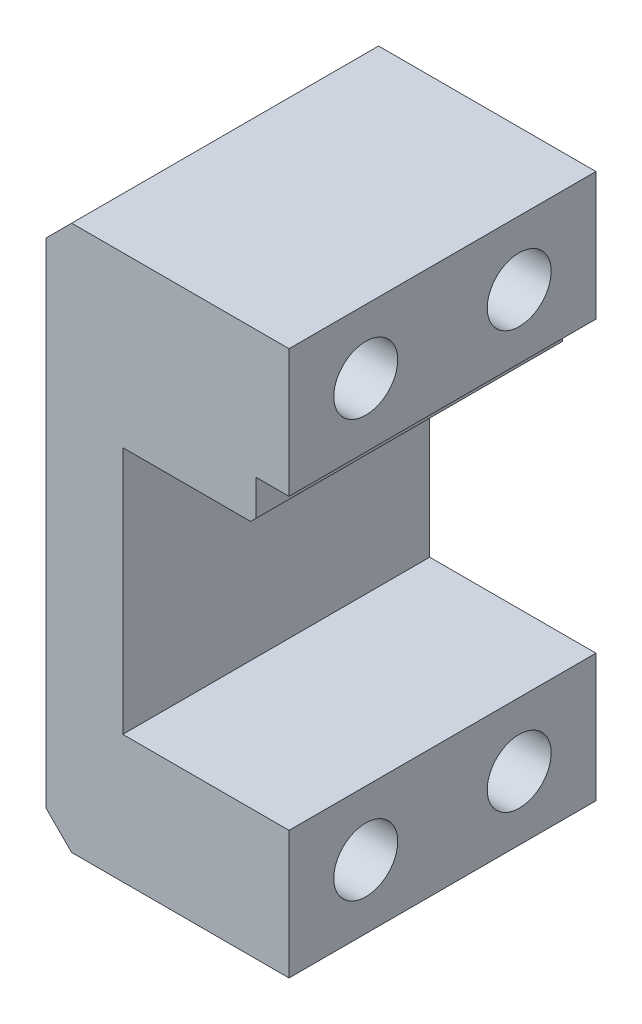
ISO-10303-21;
HEADER;
FILE_DESCRIPTION(('STEP AP214'),'2;1');
FILE_NAME('part.step','',(''),(''),'','','');
FILE_SCHEMA(('AUTOMOTIVE_DESIGN { 1 0 10303 214 1 1 1 1 }'));
ENDSEC;
DATA;
#1=APPLICATION_CONTEXT('core data for automotive mechanical design processes');
#2=APPLICATION_PROTOCOL_DEFINITION('international standard','automotive_design',2000,#1);
#3=PRODUCT_CONTEXT('',#1,'mechanical');
#4=PRODUCT('Part','Part','',(#3));
#5=PRODUCT_RELATED_PRODUCT_CATEGORY('part','',(#4));
#6=PRODUCT_DEFINITION_FORMATION('','',#4);
#7=PRODUCT_DEFINITION_CONTEXT('part definition',#1,'design');
#8=PRODUCT_DEFINITION('design','',#6,#7);
#9=PRODUCT_DEFINITION_SHAPE('','',#8);
#10=(LENGTH_UNIT() NAMED_UNIT(*) SI_UNIT(.MILLI.,.METRE.));
#11=(NAMED_UNIT(*) PLANE_ANGLE_UNIT() SI_UNIT($,.RADIAN.));
#12=(NAMED_UNIT(*) SI_UNIT($,.STERADIAN.) SOLID_ANGLE_UNIT());
#13=UNCERTAINTY_MEASURE_WITH_UNIT(LENGTH_MEASURE(1.E-05),#10,'distance_accuracy_value','');
#14=(GEOMETRIC_REPRESENTATION_CONTEXT(3) GLOBAL_UNCERTAINTY_ASSIGNED_CONTEXT((#13)) GLOBAL_UNIT_ASSIGNED_CONTEXT((#10,
#11,#12)) REPRESENTATION_CONTEXT('',''));
#15=CARTESIAN_POINT('',(0.,0.,0.));
#16=DIRECTION('',(0.,0.,1.));
#17=DIRECTION('',(1.,0.,0.));
#18=AXIS2_PLACEMENT_3D('',#15,#16,#17);
#19=CARTESIAN_POINT('',(9.5,0.,12.));
#20=DIRECTION('',(0.,1.,0.));
#21=DIRECTION('',(-1.,0.,0.));
#22=AXIS2_PLACEMENT_3D('',#19,#20,#21);
#23=PLANE('',#22);
#24=DIRECTION('',(1.,0.,0.));
#25=VECTOR('',#24,1.);
#26=CARTESIAN_POINT('',(9.5,0.,12.));
#27=LINE('',#26,#25);
#28=CARTESIAN_POINT('',(1.,0.,12.));
#29=VERTEX_POINT('',#28);
#30=CARTESIAN_POINT('',(9.5,0.,12.));
#31=VERTEX_POINT('',#30);
#32=EDGE_CURVE('E132',#29,#31,#27,.T.);
#33=ORIENTED_EDGE('',*,*,#32,.F.);
#34=DIRECTION('',(0.,0.,-1.));
#35=VECTOR('',#34,1.);
#36=CARTESIAN_POINT('',(1.,0.,12.));
#37=LINE('',#36,#35);
#38=CARTESIAN_POINT('',(1.,0.,0.));
#39=VERTEX_POINT('',#38);
#40=EDGE_CURVE('E170',#29,#39,#37,.T.);
#41=ORIENTED_EDGE('',*,*,#40,.T.);
#42=DIRECTION('',(1.,0.,0.));
#43=VECTOR('',#42,1.);
#44=CARTESIAN_POINT('',(9.5,0.,0.));
#45=LINE('',#44,#43);
#46=CARTESIAN_POINT('',(9.5,0.,0.));
#47=VERTEX_POINT('',#46);
#48=EDGE_CURVE('E154',#39,#47,#45,.T.);
#49=ORIENTED_EDGE('',*,*,#48,.T.);
#50=DIRECTION('',(0.,0.,-1.));
#51=VECTOR('',#50,1.);
#52=CARTESIAN_POINT('',(9.5,0.,12.));
#53=LINE('',#52,#51);
#54=EDGE_CURVE('E147',#31,#47,#53,.T.);
#55=ORIENTED_EDGE('',*,*,#54,.F.);
#56=EDGE_LOOP('',(#33,#41,#49,#55));
#57=FACE_BOUND('',#56,.T.);
#58=ADVANCED_FACE('F36',(#57),#23,.F.);
#59=CARTESIAN_POINT('',(9.5,5.,12.));
#60=DIRECTION('',(-1.,0.,0.));
#61=DIRECTION('',(0.,-1.,0.));
#62=AXIS2_PLACEMENT_3D('',#59,#60,#61);
#63=PLANE('',#62);
#64=CARTESIAN_POINT('',(9.5,2.5,3.));
#65=DIRECTION('',(-1.,0.,0.));
#66=DIRECTION('',(0.,0.,1.));
#67=AXIS2_PLACEMENT_3D('',#64,#65,#66);
#68=CIRCLE('',#67,1.25);
#69=CARTESIAN_POINT('',(9.5,2.5,4.25));
#70=VERTEX_POINT('',#69);
#71=EDGE_CURVE('E329',#70,#70,#68,.T.);
#72=ORIENTED_EDGE('',*,*,#71,.T.);
#73=EDGE_LOOP('',(#72));
#74=FACE_BOUND('',#73,.T.);
#75=CARTESIAN_POINT('',(9.5,2.5,9.));
#76=DIRECTION('',(-1.,0.,0.));
#77=DIRECTION('',(0.,0.,1.));
#78=AXIS2_PLACEMENT_3D('',#75,#76,#77);
#79=CIRCLE('',#78,1.25);
#80=CARTESIAN_POINT('',(9.5,2.5,10.25));
#81=VERTEX_POINT('',#80);
#82=EDGE_CURVE('E339',#81,#81,#79,.T.);
#83=ORIENTED_EDGE('',*,*,#82,.T.);
#84=EDGE_LOOP('',(#83));
#85=FACE_BOUND('',#84,.T.);
#86=DIRECTION('',(0.,1.,0.));
#87=VECTOR('',#86,1.);
#88=CARTESIAN_POINT('',(9.5,5.,0.));
#89=LINE('',#88,#87);
#90=CARTESIAN_POINT('',(9.5,5.,0.));
#91=VERTEX_POINT('',#90);
#92=EDGE_CURVE('E232',#47,#91,#89,.T.);
#93=ORIENTED_EDGE('',*,*,#92,.T.);
#94=DIRECTION('',(0.,0.,-1.));
#95=VECTOR('',#94,1.);
#96=CARTESIAN_POINT('',(9.5,5.,12.));
#97=LINE('',#96,#95);
#98=CARTESIAN_POINT('',(9.5,5.,12.));
#99=VERTEX_POINT('',#98);
#100=EDGE_CURVE('E149',#99,#91,#97,.T.);
#101=ORIENTED_EDGE('',*,*,#100,.F.);
#102=DIRECTION('',(0.,1.,0.));
#103=VECTOR('',#102,1.);
#104=CARTESIAN_POINT('',(9.5,5.,12.));
#105=LINE('',#104,#103);
#106=EDGE_CURVE('E135',#31,#99,#105,.T.);
#107=ORIENTED_EDGE('',*,*,#106,.F.);
#108=ORIENTED_EDGE('',*,*,#54,.T.);
#109=EDGE_LOOP('',(#93,#101,#107,#108));
#110=FACE_BOUND('',#109,.T.);
#111=ADVANCED_FACE('F146',(#74,#85,#110),#63,.F.);
#112=CARTESIAN_POINT('',(3.,5.,12.));
#113=DIRECTION('',(0.,-1.,0.));
#114=DIRECTION('',(1.,0.,0.));
#115=AXIS2_PLACEMENT_3D('',#112,#113,#114);
#116=PLANE('',#115);
#117=DIRECTION('',(-1.,0.,0.));
#118=VECTOR('',#117,1.);
#119=CARTESIAN_POINT('',(3.,5.,0.));
#120=LINE('',#119,#118);
#121=CARTESIAN_POINT('',(3.,5.,0.));
#122=VERTEX_POINT('',#121);
#123=EDGE_CURVE('E226',#91,#122,#120,.T.);
#124=ORIENTED_EDGE('',*,*,#123,.T.);
#125=DIRECTION('',(0.,0.,-1.));
#126=VECTOR('',#125,1.);
#127=CARTESIAN_POINT('',(3.,5.,12.));
#128=LINE('',#127,#126);
#129=CARTESIAN_POINT('',(3.,5.,12.));
#130=VERTEX_POINT('',#129);
#131=EDGE_CURVE('E161',#130,#122,#128,.T.);
#132=ORIENTED_EDGE('',*,*,#131,.F.);
#133=DIRECTION('',(-1.,0.,0.));
#134=VECTOR('',#133,1.);
#135=CARTESIAN_POINT('',(3.,5.,12.));
#136=LINE('',#135,#134);
#137=EDGE_CURVE('E151',#99,#130,#136,.T.);
#138=ORIENTED_EDGE('',*,*,#137,.F.);
#139=ORIENTED_EDGE('',*,*,#100,.T.);
#140=EDGE_LOOP('',(#124,#132,#138,#139));
#141=FACE_BOUND('',#140,.T.);
#142=ADVANCED_FACE('F255',(#141),#116,.F.);
#143=CARTESIAN_POINT('',(3.,14.71,12.));
#144=DIRECTION('',(-1.,0.,0.));
#145=DIRECTION('',(0.,-1.,0.));
#146=AXIS2_PLACEMENT_3D('',#143,#144,#145);
#147=PLANE('',#146);
#148=DIRECTION('',(0.,1.,0.));
#149=VECTOR('',#148,1.);
#150=CARTESIAN_POINT('',(3.,14.71,0.));
#151=LINE('',#150,#149);
#152=CARTESIAN_POINT('',(3.,14.71,0.));
#153=VERTEX_POINT('',#152);
#154=EDGE_CURVE('E221',#122,#153,#151,.T.);
#155=ORIENTED_EDGE('',*,*,#154,.T.);
#156=DIRECTION('',(0.,0.,-1.));
#157=VECTOR('',#156,1.);
#158=CARTESIAN_POINT('',(3.,14.71,12.));
#159=LINE('',#158,#157);
#160=CARTESIAN_POINT('',(3.,14.71,12.));
#161=VERTEX_POINT('',#160);
#162=EDGE_CURVE('E212',#161,#153,#159,.T.);
#163=ORIENTED_EDGE('',*,*,#162,.F.);
#164=DIRECTION('',(0.,1.,0.));
#165=VECTOR('',#164,1.);
#166=CARTESIAN_POINT('',(3.,14.71,12.));
#167=LINE('',#166,#165);
#168=EDGE_CURVE('E222',#130,#161,#167,.T.);
#169=ORIENTED_EDGE('',*,*,#168,.F.);
#170=ORIENTED_EDGE('',*,*,#131,.T.);
#171=EDGE_LOOP('',(#155,#163,#169,#170));
#172=FACE_BOUND('',#171,.T.);
#173=ADVANCED_FACE('F219',(#172),#147,.F.);
#174=CARTESIAN_POINT('',(8.2,14.71,12.));
#175=DIRECTION('',(0.,1.,0.));
#176=DIRECTION('',(-1.,0.,0.));
#177=AXIS2_PLACEMENT_3D('',#174,#175,#176);
#178=PLANE('',#177);
#179=DIRECTION('',(1.,0.,0.));
#180=VECTOR('',#179,1.);
#181=CARTESIAN_POINT('',(8.2,14.71,0.));
#182=LINE('',#181,#180);
#183=CARTESIAN_POINT('',(8.,14.71,0.));
#184=VERTEX_POINT('',#183);
#185=EDGE_CURVE('E228',#153,#184,#182,.T.);
#186=ORIENTED_EDGE('',*,*,#185,.T.);
#187=DIRECTION('',(0.,0.,1.));
#188=VECTOR('',#187,1.);
#189=CARTESIAN_POINT('',(8.,14.71,12.));
#190=LINE('',#189,#188);
#191=CARTESIAN_POINT('',(8.,14.71,12.));
#192=VERTEX_POINT('',#191);
#193=EDGE_CURVE('E166',#184,#192,#190,.T.);
#194=ORIENTED_EDGE('',*,*,#193,.T.);
#195=DIRECTION('',(1.,0.,0.));
#196=VECTOR('',#195,1.);
#197=CARTESIAN_POINT('',(8.2,14.71,12.));
#198=LINE('',#197,#196);
#199=EDGE_CURVE('E257',#161,#192,#198,.T.);
#200=ORIENTED_EDGE('',*,*,#199,.F.);
#201=ORIENTED_EDGE('',*,*,#162,.T.);
#202=EDGE_LOOP('',(#186,#194,#200,#201));
#203=FACE_BOUND('',#202,.T.);
#204=ADVANCED_FACE('F269',(#203),#178,.F.);
#205=CARTESIAN_POINT('',(8.2,16.31,12.));
#206=DIRECTION('',(-1.,0.,0.));
#207=DIRECTION('',(0.,0.,1.));
#208=AXIS2_PLACEMENT_3D('',#205,#206,#207);
#209=PLANE('',#208);
#210=DIRECTION('',(0.,1.,0.));
#211=VECTOR('',#210,1.);
#212=CARTESIAN_POINT('',(8.2,16.31,12.));
#213=LINE('',#212,#211);
#214=CARTESIAN_POINT('',(8.2,14.91,12.));
#215=VERTEX_POINT('',#214);
#216=CARTESIAN_POINT('',(8.2,16.31,12.));
#217=VERTEX_POINT('',#216);
#218=EDGE_CURVE('E250',#215,#217,#213,.T.);
#219=ORIENTED_EDGE('',*,*,#218,.F.);
#220=DIRECTION('',(0.,0.,-1.));
#221=VECTOR('',#220,1.);
#222=CARTESIAN_POINT('',(8.2,14.91,12.));
#223=LINE('',#222,#221);
#224=CARTESIAN_POINT('',(8.2,14.91,0.));
#225=VERTEX_POINT('',#224);
#226=EDGE_CURVE('E156',#215,#225,#223,.T.);
#227=ORIENTED_EDGE('',*,*,#226,.T.);
#228=DIRECTION('',(0.,1.,0.));
#229=VECTOR('',#228,1.);
#230=CARTESIAN_POINT('',(8.2,16.31,0.));
#231=LINE('',#230,#229);
#232=CARTESIAN_POINT('',(8.2,16.31,0.));
#233=VERTEX_POINT('',#232);
#234=EDGE_CURVE('E230',#225,#233,#231,.T.);
#235=ORIENTED_EDGE('',*,*,#234,.T.);
#236=DIRECTION('',(0.,0.,-1.));
#237=VECTOR('',#236,1.);
#238=CARTESIAN_POINT('',(8.2,16.31,12.));
#239=LINE('',#238,#237);
#240=EDGE_CURVE('E209',#217,#233,#239,.T.);
#241=ORIENTED_EDGE('',*,*,#240,.F.);
#242=EDGE_LOOP('',(#219,#227,#235,#241));
#243=FACE_BOUND('',#242,.T.);
#244=ADVANCED_FACE('F265',(#243),#209,.F.);
#245=CARTESIAN_POINT('',(9.5,16.31,12.));
#246=DIRECTION('',(0.,1.,0.));
#247=DIRECTION('',(0.,0.,1.));
#248=AXIS2_PLACEMENT_3D('',#245,#246,#247);
#249=PLANE('',#248);
#250=DIRECTION('',(1.,0.,0.));
#251=VECTOR('',#250,1.);
#252=CARTESIAN_POINT('',(9.5,16.31,0.));
#253=LINE('',#252,#251);
#254=CARTESIAN_POINT('',(9.5,16.31,0.));
#255=VERTEX_POINT('',#254);
#256=EDGE_CURVE('E201',#233,#255,#253,.T.);
#257=ORIENTED_EDGE('',*,*,#256,.T.);
#258=DIRECTION('',(0.,0.,-1.));
#259=VECTOR('',#258,1.);
#260=CARTESIAN_POINT('',(9.5,16.31,12.));
#261=LINE('',#260,#259);
#262=CARTESIAN_POINT('',(9.5,16.31,12.));
#263=VERTEX_POINT('',#262);
#264=EDGE_CURVE('E206',#263,#255,#261,.T.);
#265=ORIENTED_EDGE('',*,*,#264,.F.);
#266=DIRECTION('',(1.,0.,0.));
#267=VECTOR('',#266,1.);
#268=CARTESIAN_POINT('',(9.5,16.31,12.));
#269=LINE('',#268,#267);
#270=EDGE_CURVE('E247',#217,#263,#269,.T.);
#271=ORIENTED_EDGE('',*,*,#270,.F.);
#272=ORIENTED_EDGE('',*,*,#240,.T.);
#273=EDGE_LOOP('',(#257,#265,#271,#272));
#274=FACE_BOUND('',#273,.T.);
#275=ADVANCED_FACE('F239',(#274),#249,.F.);
#276=CARTESIAN_POINT('',(9.5,21.31,12.));
#277=DIRECTION('',(-1.,0.,0.));
#278=DIRECTION('',(0.,0.,1.));
#279=AXIS2_PLACEMENT_3D('',#276,#277,#278);
#280=PLANE('',#279);
#281=CARTESIAN_POINT('',(9.5,18.81,9.));
#282=DIRECTION('',(-1.,0.,0.));
#283=DIRECTION('',(0.,0.,1.));
#284=AXIS2_PLACEMENT_3D('',#281,#282,#283);
#285=CIRCLE('',#284,1.25);
#286=CARTESIAN_POINT('',(9.5,18.81,10.25));
#287=VERTEX_POINT('',#286);
#288=EDGE_CURVE('E345',#287,#287,#285,.T.);
#289=ORIENTED_EDGE('',*,*,#288,.T.);
#290=EDGE_LOOP('',(#289));
#291=FACE_BOUND('',#290,.T.);
#292=CARTESIAN_POINT('',(9.5,18.81,3.));
#293=DIRECTION('',(-1.,0.,0.));
#294=DIRECTION('',(0.,0.,1.));
#295=AXIS2_PLACEMENT_3D('',#292,#293,#294);
#296=CIRCLE('',#295,1.25);
#297=CARTESIAN_POINT('',(9.5,18.81,4.25));
#298=VERTEX_POINT('',#297);
#299=EDGE_CURVE('E254',#298,#298,#296,.T.);
#300=ORIENTED_EDGE('',*,*,#299,.T.);
#301=EDGE_LOOP('',(#300));
#302=FACE_BOUND('',#301,.T.);
#303=DIRECTION('',(0.,1.,0.));
#304=VECTOR('',#303,1.);
#305=CARTESIAN_POINT('',(9.5,21.31,0.));
#306=LINE('',#305,#304);
#307=CARTESIAN_POINT('',(9.5,21.31,0.));
#308=VERTEX_POINT('',#307);
#309=EDGE_CURVE('E198',#255,#308,#306,.T.);
#310=ORIENTED_EDGE('',*,*,#309,.T.);
#311=DIRECTION('',(0.,0.,-1.));
#312=VECTOR('',#311,1.);
#313=CARTESIAN_POINT('',(9.5,21.31,12.));
#314=LINE('',#313,#312);
#315=CARTESIAN_POINT('',(9.5,21.31,12.));
#316=VERTEX_POINT('',#315);
#317=EDGE_CURVE('E188',#316,#308,#314,.T.);
#318=ORIENTED_EDGE('',*,*,#317,.F.);
#319=DIRECTION('',(0.,1.,0.));
#320=VECTOR('',#319,1.);
#321=CARTESIAN_POINT('',(9.5,21.31,12.));
#322=LINE('',#321,#320);
#323=EDGE_CURVE('E246',#263,#316,#322,.T.);
#324=ORIENTED_EDGE('',*,*,#323,.F.);
#325=ORIENTED_EDGE('',*,*,#264,.T.);
#326=EDGE_LOOP('',(#310,#318,#324,#325));
#327=FACE_BOUND('',#326,.T.);
#328=ADVANCED_FACE('F245',(#291,#302,#327),#280,.F.);
#329=CARTESIAN_POINT('',(0.,21.31,12.));
#330=DIRECTION('',(0.,-1.,0.));
#331=DIRECTION('',(0.,0.,-1.));
#332=AXIS2_PLACEMENT_3D('',#329,#330,#331);
#333=PLANE('',#332);
#334=DIRECTION('',(-1.,0.,0.));
#335=VECTOR('',#334,1.);
#336=CARTESIAN_POINT('',(0.,21.31,0.));
#337=LINE('',#336,#335);
#338=CARTESIAN_POINT('',(1.,21.31,0.));
#339=VERTEX_POINT('',#338);
#340=EDGE_CURVE('E194',#308,#339,#337,.T.);
#341=ORIENTED_EDGE('',*,*,#340,.T.);
#342=DIRECTION('',(0.,0.,1.));
#343=VECTOR('',#342,1.);
#344=CARTESIAN_POINT('',(1.,21.31,12.));
#345=LINE('',#344,#343);
#346=CARTESIAN_POINT('',(1.,21.31,12.));
#347=VERTEX_POINT('',#346);
#348=EDGE_CURVE('E11',#339,#347,#345,.T.);
#349=ORIENTED_EDGE('',*,*,#348,.T.);
#350=DIRECTION('',(-1.,0.,0.));
#351=VECTOR('',#350,1.);
#352=CARTESIAN_POINT('',(0.,21.31,12.));
#353=LINE('',#352,#351);
#354=EDGE_CURVE('E183',#316,#347,#353,.T.);
#355=ORIENTED_EDGE('',*,*,#354,.F.);
#356=ORIENTED_EDGE('',*,*,#317,.T.);
#357=EDGE_LOOP('',(#341,#349,#355,#356));
#358=FACE_BOUND('',#357,.T.);
#359=ADVANCED_FACE('F196',(#358),#333,.F.);
#360=CARTESIAN_POINT('',(0.,0.,12.));
#361=DIRECTION('',(1.,0.,0.));
#362=DIRECTION('',(0.,0.,-1.));
#363=AXIS2_PLACEMENT_3D('',#360,#361,#362);
#364=PLANE('',#363);
#365=CARTESIAN_POINT('',(0.,2.5,3.));
#366=DIRECTION('',(-1.,0.,0.));
#367=DIRECTION('',(0.,0.,1.));
#368=AXIS2_PLACEMENT_3D('',#365,#366,#367);
#369=CIRCLE('',#368,1.25);
#370=CARTESIAN_POINT('',(0.,2.5,4.25));
#371=VERTEX_POINT('',#370);
#372=EDGE_CURVE('E332',#371,#371,#369,.T.);
#373=ORIENTED_EDGE('',*,*,#372,.F.);
#374=EDGE_LOOP('',(#373));
#375=FACE_BOUND('',#374,.T.);
#376=CARTESIAN_POINT('',(0.,2.5,9.));
#377=DIRECTION('',(-1.,0.,0.));
#378=DIRECTION('',(0.,0.,1.));
#379=AXIS2_PLACEMENT_3D('',#376,#377,#378);
#380=CIRCLE('',#379,1.25);
#381=CARTESIAN_POINT('',(0.,2.5,10.25));
#382=VERTEX_POINT('',#381);
#383=EDGE_CURVE('E334',#382,#382,#380,.T.);
#384=ORIENTED_EDGE('',*,*,#383,.F.);
#385=EDGE_LOOP('',(#384));
#386=FACE_BOUND('',#385,.T.);
#387=CARTESIAN_POINT('',(0.,18.81,9.));
#388=DIRECTION('',(-1.,0.,0.));
#389=DIRECTION('',(0.,0.,1.));
#390=AXIS2_PLACEMENT_3D('',#387,#388,#389);
#391=CIRCLE('',#390,1.25);
#392=CARTESIAN_POINT('',(0.,18.81,10.25));
#393=VERTEX_POINT('',#392);
#394=EDGE_CURVE('E342',#393,#393,#391,.T.);
#395=ORIENTED_EDGE('',*,*,#394,.F.);
#396=EDGE_LOOP('',(#395));
#397=FACE_BOUND('',#396,.T.);
#398=CARTESIAN_POINT('',(0.,18.81,3.));
#399=DIRECTION('',(-1.,0.,0.));
#400=DIRECTION('',(0.,0.,1.));
#401=AXIS2_PLACEMENT_3D('',#398,#399,#400);
#402=CIRCLE('',#401,1.25);
#403=CARTESIAN_POINT('',(0.,18.81,4.25));
#404=VERTEX_POINT('',#403);
#405=EDGE_CURVE('E348',#404,#404,#402,.T.);
#406=ORIENTED_EDGE('',*,*,#405,.F.);
#407=EDGE_LOOP('',(#406));
#408=FACE_BOUND('',#407,.T.);
#409=DIRECTION('',(0.,-1.,0.));
#410=VECTOR('',#409,1.);
#411=CARTESIAN_POINT('',(0.,0.,0.));
#412=LINE('',#411,#410);
#413=CARTESIAN_POINT('',(0.,20.31,0.));
#414=VERTEX_POINT('',#413);
#415=CARTESIAN_POINT('',(0.,1.,0.));
#416=VERTEX_POINT('',#415);
#417=EDGE_CURVE('E142',#414,#416,#412,.T.);
#418=ORIENTED_EDGE('',*,*,#417,.T.);
#419=DIRECTION('',(0.,0.,1.));
#420=VECTOR('',#419,1.);
#421=CARTESIAN_POINT('',(0.,1.,12.));
#422=LINE('',#421,#420);
#423=CARTESIAN_POINT('',(0.,1.,12.));
#424=VERTEX_POINT('',#423);
#425=EDGE_CURVE('E57',#416,#424,#422,.T.);
#426=ORIENTED_EDGE('',*,*,#425,.T.);
#427=DIRECTION('',(0.,-1.,0.));
#428=VECTOR('',#427,1.);
#429=CARTESIAN_POINT('',(0.,0.,12.));
#430=LINE('',#429,#428);
#431=CARTESIAN_POINT('',(0.,20.31,12.));
#432=VERTEX_POINT('',#431);
#433=EDGE_CURVE('E182',#432,#424,#430,.T.);
#434=ORIENTED_EDGE('',*,*,#433,.F.);
#435=DIRECTION('',(0.,0.,-1.));
#436=VECTOR('',#435,1.);
#437=CARTESIAN_POINT('',(0.,20.31,12.));
#438=LINE('',#437,#436);
#439=EDGE_CURVE('E176',#432,#414,#438,.T.);
#440=ORIENTED_EDGE('',*,*,#439,.T.);
#441=EDGE_LOOP('',(#418,#426,#434,#440));
#442=FACE_BOUND('',#441,.T.);
#443=ADVANCED_FACE('F186',(#375,#386,#397,#408,#442),#364,.F.);
#444=CARTESIAN_POINT('',(0.,0.,12.));
#445=DIRECTION('',(0.,0.,-1.));
#446=DIRECTION('',(-1.,0.,0.));
#447=AXIS2_PLACEMENT_3D('',#444,#445,#446);
#448=PLANE('',#447);
#449=ORIENTED_EDGE('',*,*,#433,.T.);
#450=DIRECTION('',(-0.707106781186548,0.707106781186548,0.));
#451=VECTOR('',#450,1.);
#452=CARTESIAN_POINT('',(1.,0.,12.));
#453=LINE('',#452,#451);
#454=EDGE_CURVE('E44',#424,#29,#453,.F.);
#455=ORIENTED_EDGE('',*,*,#454,.T.);
#456=ORIENTED_EDGE('',*,*,#32,.T.);
#457=ORIENTED_EDGE('',*,*,#106,.T.);
#458=ORIENTED_EDGE('',*,*,#137,.T.);
#459=ORIENTED_EDGE('',*,*,#168,.T.);
#460=ORIENTED_EDGE('',*,*,#199,.T.);
#461=DIRECTION('',(-0.707106781186541,-0.707106781186554,0.));
#462=VECTOR('',#461,1.);
#463=CARTESIAN_POINT('',(8.2,14.91,12.));
#464=LINE('',#463,#462);
#465=EDGE_CURVE('E168',#192,#215,#464,.F.);
#466=ORIENTED_EDGE('',*,*,#465,.T.);
#467=ORIENTED_EDGE('',*,*,#218,.T.);
#468=ORIENTED_EDGE('',*,*,#270,.T.);
#469=ORIENTED_EDGE('',*,*,#323,.T.);
#470=ORIENTED_EDGE('',*,*,#354,.T.);
#471=DIRECTION('',(0.707106781186548,0.707106781186548,0.));
#472=VECTOR('',#471,1.);
#473=CARTESIAN_POINT('',(0.,20.31,12.));
#474=LINE('',#473,#472);
#475=EDGE_CURVE('E180',#347,#432,#474,.F.);
#476=ORIENTED_EDGE('',*,*,#475,.T.);
#477=EDGE_LOOP('',(#449,#455,#456,#457,#458,#459,#460,#466,#467,#468,#469,#470,#476));
#478=FACE_BOUND('',#477,.T.);
#479=ADVANCED_FACE('F134',(#478),#448,.F.);
#480=CARTESIAN_POINT('',(0.,0.,0.));
#481=DIRECTION('',(0.,0.,-1.));
#482=DIRECTION('',(-1.,0.,0.));
#483=AXIS2_PLACEMENT_3D('',#480,#481,#482);
#484=PLANE('',#483);
#485=ORIENTED_EDGE('',*,*,#48,.F.);
#486=DIRECTION('',(0.707106781186548,-0.707106781186548,0.));
#487=VECTOR('',#486,1.);
#488=CARTESIAN_POINT('',(0.5,0.5,0.));
#489=LINE('',#488,#487);
#490=EDGE_CURVE('E174',#39,#416,#489,.F.);
#491=ORIENTED_EDGE('',*,*,#490,.T.);
#492=ORIENTED_EDGE('',*,*,#417,.F.);
#493=DIRECTION('',(-0.707106781186548,-0.707106781186548,0.));
#494=VECTOR('',#493,1.);
#495=CARTESIAN_POINT('',(-10.155,10.155,0.));
#496=LINE('',#495,#494);
#497=EDGE_CURVE('E172',#414,#339,#496,.F.);
#498=ORIENTED_EDGE('',*,*,#497,.T.);
#499=ORIENTED_EDGE('',*,*,#340,.F.);
#500=ORIENTED_EDGE('',*,*,#309,.F.);
#501=ORIENTED_EDGE('',*,*,#256,.F.);
#502=ORIENTED_EDGE('',*,*,#234,.F.);
#503=DIRECTION('',(0.707106781186541,0.707106781186554,0.));
#504=VECTOR('',#503,1.);
#505=CARTESIAN_POINT('',(-3.35499999999993,3.35499999999987,0.));
#506=LINE('',#505,#504);
#507=EDGE_CURVE('E159',#225,#184,#506,.F.);
#508=ORIENTED_EDGE('',*,*,#507,.T.);
#509=ORIENTED_EDGE('',*,*,#185,.F.);
#510=ORIENTED_EDGE('',*,*,#154,.F.);
#511=ORIENTED_EDGE('',*,*,#123,.F.);
#512=ORIENTED_EDGE('',*,*,#92,.F.);
#513=EDGE_LOOP('',(#485,#491,#492,#498,#499,#500,#501,#502,#508,#509,#510,#511,#512));
#514=FACE_BOUND('',#513,.T.);
#515=ADVANCED_FACE('F192',(#514),#484,.T.);
#516=CARTESIAN_POINT('',(8.2,14.91,12.));
#517=DIRECTION('',(-0.707106781186554,0.707106781186541,0.));
#518=DIRECTION('',(0.,0.,-1.));
#519=AXIS2_PLACEMENT_3D('',#516,#517,#518);
#520=PLANE('',#519);
#521=ORIENTED_EDGE('',*,*,#465,.F.);
#522=ORIENTED_EDGE('',*,*,#193,.F.);
#523=ORIENTED_EDGE('',*,*,#507,.F.);
#524=ORIENTED_EDGE('',*,*,#226,.F.);
#525=EDGE_LOOP('',(#521,#522,#523,#524));
#526=FACE_BOUND('',#525,.T.);
#527=ADVANCED_FACE('F271',(#526),#520,.F.);
#528=CARTESIAN_POINT('',(0.,18.81,3.));
#529=DIRECTION('',(-1.,0.,0.));
#530=DIRECTION('',(0.,0.,1.));
#531=AXIS2_PLACEMENT_3D('',#528,#529,#530);
#532=CYLINDRICAL_SURFACE('',#531,1.25);
#533=ORIENTED_EDGE('',*,*,#299,.F.);
#534=EDGE_LOOP('',(#533));
#535=FACE_BOUND('',#534,.T.);
#536=ORIENTED_EDGE('',*,*,#405,.T.);
#537=EDGE_LOOP('',(#536));
#538=FACE_BOUND('',#537,.T.);
#539=ADVANCED_FACE('F273',(#535,#538),#532,.F.);
#540=CARTESIAN_POINT('',(0.,18.81,9.));
#541=DIRECTION('',(-1.,0.,0.));
#542=DIRECTION('',(0.,0.,1.));
#543=AXIS2_PLACEMENT_3D('',#540,#541,#542);
#544=CYLINDRICAL_SURFACE('',#543,1.25);
#545=ORIENTED_EDGE('',*,*,#288,.F.);
#546=EDGE_LOOP('',(#545));
#547=FACE_BOUND('',#546,.T.);
#548=ORIENTED_EDGE('',*,*,#394,.T.);
#549=EDGE_LOOP('',(#548));
#550=FACE_BOUND('',#549,.T.);
#551=ADVANCED_FACE('F279',(#547,#550),#544,.F.);
#552=CARTESIAN_POINT('',(0.,2.5,9.));
#553=DIRECTION('',(-1.,0.,0.));
#554=DIRECTION('',(0.,0.,1.));
#555=AXIS2_PLACEMENT_3D('',#552,#553,#554);
#556=CYLINDRICAL_SURFACE('',#555,1.25);
#557=ORIENTED_EDGE('',*,*,#82,.F.);
#558=EDGE_LOOP('',(#557));
#559=FACE_BOUND('',#558,.T.);
#560=ORIENTED_EDGE('',*,*,#383,.T.);
#561=EDGE_LOOP('',(#560));
#562=FACE_BOUND('',#561,.T.);
#563=ADVANCED_FACE('F313',(#559,#562),#556,.F.);
#564=CARTESIAN_POINT('',(0.,2.5,3.));
#565=DIRECTION('',(-1.,0.,0.));
#566=DIRECTION('',(0.,0.,1.));
#567=AXIS2_PLACEMENT_3D('',#564,#565,#566);
#568=CYLINDRICAL_SURFACE('',#567,1.25);
#569=ORIENTED_EDGE('',*,*,#71,.F.);
#570=EDGE_LOOP('',(#569));
#571=FACE_BOUND('',#570,.T.);
#572=ORIENTED_EDGE('',*,*,#372,.T.);
#573=EDGE_LOOP('',(#572));
#574=FACE_BOUND('',#573,.T.);
#575=ADVANCED_FACE('F317',(#571,#574),#568,.F.);
#576=CARTESIAN_POINT('',(1.,0.,12.));
#577=DIRECTION('',(0.707106781186547,0.707106781186547,0.));
#578=DIRECTION('',(0.,0.,-1.));
#579=AXIS2_PLACEMENT_3D('',#576,#577,#578);
#580=PLANE('',#579);
#581=ORIENTED_EDGE('',*,*,#454,.F.);
#582=ORIENTED_EDGE('',*,*,#425,.F.);
#583=ORIENTED_EDGE('',*,*,#490,.F.);
#584=ORIENTED_EDGE('',*,*,#40,.F.);
#585=EDGE_LOOP('',(#581,#582,#583,#584));
#586=FACE_BOUND('',#585,.T.);
#587=ADVANCED_FACE('F320',(#586),#580,.F.);
#588=CARTESIAN_POINT('',(0.,20.31,12.));
#589=DIRECTION('',(0.707106781186547,-0.707106781186547,0.));
#590=DIRECTION('',(0.,0.,-1.));
#591=AXIS2_PLACEMENT_3D('',#588,#589,#590);
#592=PLANE('',#591);
#593=ORIENTED_EDGE('',*,*,#475,.F.);
#594=ORIENTED_EDGE('',*,*,#348,.F.);
#595=ORIENTED_EDGE('',*,*,#497,.F.);
#596=ORIENTED_EDGE('',*,*,#439,.F.);
#597=EDGE_LOOP('',(#593,#594,#595,#596));
#598=FACE_BOUND('',#597,.T.);
#599=ADVANCED_FACE('F38',(#598),#592,.F.);
#600=CLOSED_SHELL('',(#58,#111,#142,#173,#204,#244,#275,#328,#359,#443,#479,#515,#527,#539,#551,
#563,#575,#587,#599));
#601=MANIFOLD_SOLID_BREP('B2',#600);
#602=ADVANCED_BREP_SHAPE_REPRESENTATION('',(#18,#601),#14);
#603=SHAPE_DEFINITION_REPRESENTATION(#9,#602);
ENDSEC;
END-ISO-10303-21;
